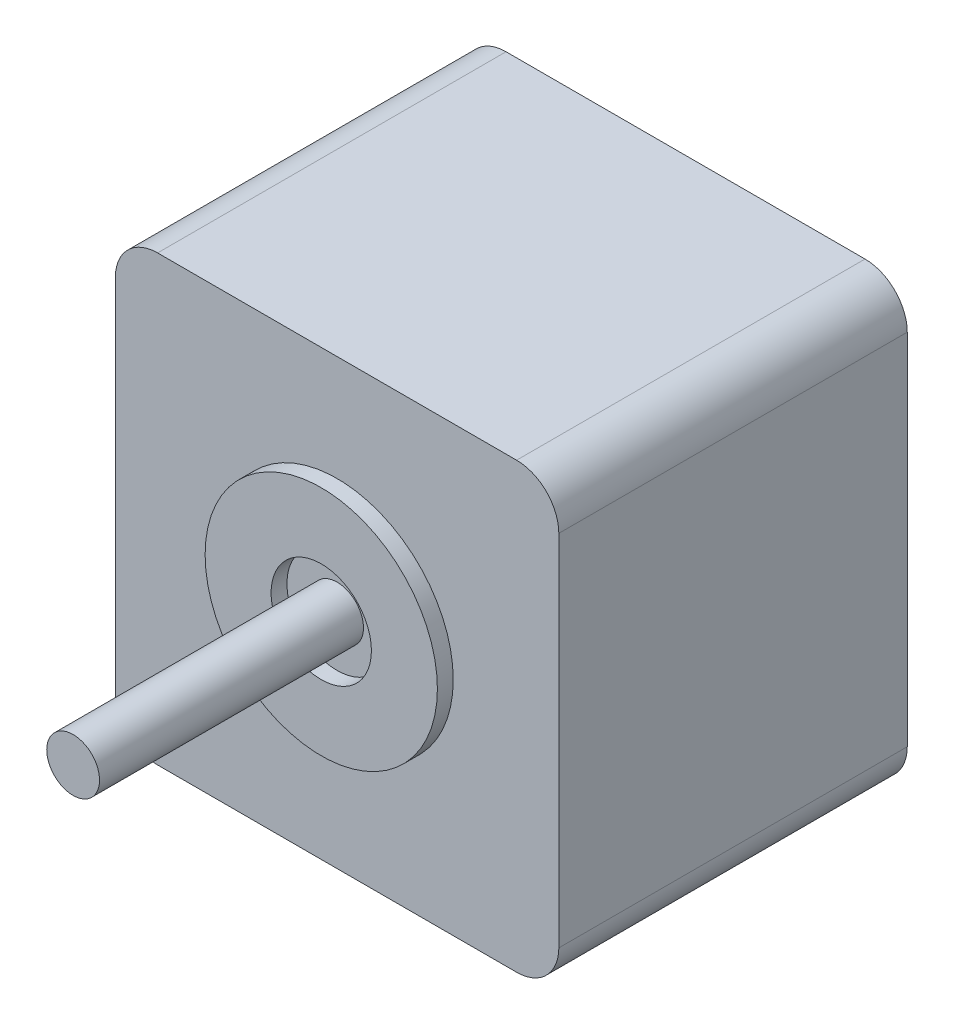
ISO-10303-21;
HEADER;
FILE_DESCRIPTION(('STEP AP214'),'2;1');
FILE_NAME('part.step','',(''),(''),'','','');
FILE_SCHEMA(('AUTOMOTIVE_DESIGN { 1 0 10303 214 1 1 1 1 }'));
ENDSEC;
DATA;
#1=APPLICATION_CONTEXT('core data for automotive mechanical design processes');
#2=APPLICATION_PROTOCOL_DEFINITION('international standard','automotive_design',2000,#1);
#3=PRODUCT_CONTEXT('',#1,'mechanical');
#4=PRODUCT('Part','Part','',(#3));
#5=PRODUCT_RELATED_PRODUCT_CATEGORY('part','',(#4));
#6=PRODUCT_DEFINITION_FORMATION('','',#4);
#7=PRODUCT_DEFINITION_CONTEXT('part definition',#1,'design');
#8=PRODUCT_DEFINITION('design','',#6,#7);
#9=PRODUCT_DEFINITION_SHAPE('','',#8);
#10=(LENGTH_UNIT() NAMED_UNIT(*) SI_UNIT(.MILLI.,.METRE.));
#11=(NAMED_UNIT(*) PLANE_ANGLE_UNIT() SI_UNIT($,.RADIAN.));
#12=(NAMED_UNIT(*) SI_UNIT($,.STERADIAN.) SOLID_ANGLE_UNIT());
#13=UNCERTAINTY_MEASURE_WITH_UNIT(LENGTH_MEASURE(1.E-05),#10,'distance_accuracy_value','');
#14=(GEOMETRIC_REPRESENTATION_CONTEXT(3) GLOBAL_UNCERTAINTY_ASSIGNED_CONTEXT((#13)) GLOBAL_UNIT_ASSIGNED_CONTEXT((#10,
#11,#12)) REPRESENTATION_CONTEXT('',''));
#15=CARTESIAN_POINT('',(0.,0.,0.));
#16=DIRECTION('',(0.,0.,1.));
#17=DIRECTION('',(1.,0.,0.));
#18=AXIS2_PLACEMENT_3D('',#15,#16,#17);
#19=CARTESIAN_POINT('',(21.,-21.,33.));
#20=DIRECTION('',(-1.,0.,0.));
#21=DIRECTION('',(0.,0.,1.));
#22=AXIS2_PLACEMENT_3D('',#19,#20,#21);
#23=PLANE('',#22);
#24=DIRECTION('',(0.,1.,0.));
#25=VECTOR('',#24,1.);
#26=CARTESIAN_POINT('',(21.,-21.,33.));
#27=LINE('',#26,#25);
#28=CARTESIAN_POINT('',(21.,-17.,33.));
#29=VERTEX_POINT('',#28);
#30=CARTESIAN_POINT('',(21.,17.,33.));
#31=VERTEX_POINT('',#30);
#32=EDGE_CURVE('E129',#29,#31,#27,.T.);
#33=ORIENTED_EDGE('',*,*,#32,.F.);
#34=DIRECTION('',(0.,0.,-1.));
#35=VECTOR('',#34,1.);
#36=CARTESIAN_POINT('',(21.,-17.,33.));
#37=LINE('',#36,#35);
#38=CARTESIAN_POINT('',(21.,-17.,0.));
#39=VERTEX_POINT('',#38);
#40=EDGE_CURVE('E155',#29,#39,#37,.T.);
#41=ORIENTED_EDGE('',*,*,#40,.T.);
#42=DIRECTION('',(0.,1.,0.));
#43=VECTOR('',#42,1.);
#44=CARTESIAN_POINT('',(21.,-21.,0.));
#45=LINE('',#44,#43);
#46=CARTESIAN_POINT('',(21.,17.,0.));
#47=VERTEX_POINT('',#46);
#48=EDGE_CURVE('E180',#39,#47,#45,.T.);
#49=ORIENTED_EDGE('',*,*,#48,.T.);
#50=DIRECTION('',(0.,0.,-1.));
#51=VECTOR('',#50,1.);
#52=CARTESIAN_POINT('',(21.,17.,33.));
#53=LINE('',#52,#51);
#54=EDGE_CURVE('E153',#47,#31,#53,.F.);
#55=ORIENTED_EDGE('',*,*,#54,.T.);
#56=EDGE_LOOP('',(#33,#41,#49,#55));
#57=FACE_BOUND('',#56,.T.);
#58=ADVANCED_FACE('F36',(#57),#23,.F.);
#59=CARTESIAN_POINT('',(-21.,21.,33.));
#60=DIRECTION('',(0.,-1.,0.));
#61=DIRECTION('',(0.,0.,-1.));
#62=AXIS2_PLACEMENT_3D('',#59,#60,#61);
#63=PLANE('',#62);
#64=DIRECTION('',(-1.,0.,0.));
#65=VECTOR('',#64,1.);
#66=CARTESIAN_POINT('',(-21.,21.,33.));
#67=LINE('',#66,#65);
#68=CARTESIAN_POINT('',(17.,21.,33.));
#69=VERTEX_POINT('',#68);
#70=CARTESIAN_POINT('',(-17.,21.,33.));
#71=VERTEX_POINT('',#70);
#72=EDGE_CURVE('E132',#69,#71,#67,.T.);
#73=ORIENTED_EDGE('',*,*,#72,.F.);
#74=DIRECTION('',(0.,0.,-1.));
#75=VECTOR('',#74,1.);
#76=CARTESIAN_POINT('',(17.,21.,33.));
#77=LINE('',#76,#75);
#78=CARTESIAN_POINT('',(17.,21.,0.));
#79=VERTEX_POINT('',#78);
#80=EDGE_CURVE('E159',#69,#79,#77,.T.);
#81=ORIENTED_EDGE('',*,*,#80,.T.);
#82=DIRECTION('',(-1.,0.,0.));
#83=VECTOR('',#82,1.);
#84=CARTESIAN_POINT('',(-21.,21.,0.));
#85=LINE('',#84,#83);
#86=CARTESIAN_POINT('',(-17.,21.,0.));
#87=VERTEX_POINT('',#86);
#88=EDGE_CURVE('E134',#79,#87,#85,.T.);
#89=ORIENTED_EDGE('',*,*,#88,.T.);
#90=DIRECTION('',(0.,0.,-1.));
#91=VECTOR('',#90,1.);
#92=CARTESIAN_POINT('',(-17.,21.,33.));
#93=LINE('',#92,#91);
#94=EDGE_CURVE('E51',#87,#71,#93,.F.);
#95=ORIENTED_EDGE('',*,*,#94,.T.);
#96=EDGE_LOOP('',(#73,#81,#89,#95));
#97=FACE_BOUND('',#96,.T.);
#98=ADVANCED_FACE('F184',(#97),#63,.F.);
#99=CARTESIAN_POINT('',(-21.,-21.,33.));
#100=DIRECTION('',(1.,0.,0.));
#101=DIRECTION('',(0.,0.,-1.));
#102=AXIS2_PLACEMENT_3D('',#99,#100,#101);
#103=PLANE('',#102);
#104=DIRECTION('',(0.,-1.,0.));
#105=VECTOR('',#104,1.);
#106=CARTESIAN_POINT('',(-21.,-21.,0.));
#107=LINE('',#106,#105);
#108=CARTESIAN_POINT('',(-21.,17.,0.));
#109=VERTEX_POINT('',#108);
#110=CARTESIAN_POINT('',(-21.,-17.,0.));
#111=VERTEX_POINT('',#110);
#112=EDGE_CURVE('E130',#109,#111,#107,.T.);
#113=ORIENTED_EDGE('',*,*,#112,.T.);
#114=DIRECTION('',(0.,0.,-1.));
#115=VECTOR('',#114,1.);
#116=CARTESIAN_POINT('',(-21.,-17.,33.));
#117=LINE('',#116,#115);
#118=CARTESIAN_POINT('',(-21.,-17.,33.));
#119=VERTEX_POINT('',#118);
#120=EDGE_CURVE('E108',#111,#119,#117,.F.);
#121=ORIENTED_EDGE('',*,*,#120,.T.);
#122=DIRECTION('',(0.,-1.,0.));
#123=VECTOR('',#122,1.);
#124=CARTESIAN_POINT('',(-21.,-21.,33.));
#125=LINE('',#124,#123);
#126=CARTESIAN_POINT('',(-21.,17.,33.));
#127=VERTEX_POINT('',#126);
#128=EDGE_CURVE('E172',#127,#119,#125,.T.);
#129=ORIENTED_EDGE('',*,*,#128,.F.);
#130=DIRECTION('',(0.,0.,-1.));
#131=VECTOR('',#130,1.);
#132=CARTESIAN_POINT('',(-21.,17.,33.));
#133=LINE('',#132,#131);
#134=EDGE_CURVE('E113',#127,#109,#133,.T.);
#135=ORIENTED_EDGE('',*,*,#134,.T.);
#136=EDGE_LOOP('',(#113,#121,#129,#135));
#137=FACE_BOUND('',#136,.T.);
#138=ADVANCED_FACE('F187',(#137),#103,.F.);
#139=CARTESIAN_POINT('',(-21.,-21.,33.));
#140=DIRECTION('',(0.,1.,0.));
#141=DIRECTION('',(0.,0.,1.));
#142=AXIS2_PLACEMENT_3D('',#139,#140,#141);
#143=PLANE('',#142);
#144=DIRECTION('',(1.,0.,0.));
#145=VECTOR('',#144,1.);
#146=CARTESIAN_POINT('',(-21.,-21.,33.));
#147=LINE('',#146,#145);
#148=CARTESIAN_POINT('',(-17.,-21.,33.));
#149=VERTEX_POINT('',#148);
#150=CARTESIAN_POINT('',(17.,-21.,33.));
#151=VERTEX_POINT('',#150);
#152=EDGE_CURVE('E123',#149,#151,#147,.T.);
#153=ORIENTED_EDGE('',*,*,#152,.F.);
#154=DIRECTION('',(0.,0.,-1.));
#155=VECTOR('',#154,1.);
#156=CARTESIAN_POINT('',(-17.,-21.,33.));
#157=LINE('',#156,#155);
#158=CARTESIAN_POINT('',(-17.,-21.,0.));
#159=VERTEX_POINT('',#158);
#160=EDGE_CURVE('E107',#149,#159,#157,.T.);
#161=ORIENTED_EDGE('',*,*,#160,.T.);
#162=DIRECTION('',(1.,0.,0.));
#163=VECTOR('',#162,1.);
#164=CARTESIAN_POINT('',(-21.,-21.,0.));
#165=LINE('',#164,#163);
#166=CARTESIAN_POINT('',(17.,-21.,0.));
#167=VERTEX_POINT('',#166);
#168=EDGE_CURVE('E120',#159,#167,#165,.T.);
#169=ORIENTED_EDGE('',*,*,#168,.T.);
#170=DIRECTION('',(0.,0.,-1.));
#171=VECTOR('',#170,1.);
#172=CARTESIAN_POINT('',(17.,-21.,33.));
#173=LINE('',#172,#171);
#174=EDGE_CURVE('E125',#167,#151,#173,.F.);
#175=ORIENTED_EDGE('',*,*,#174,.T.);
#176=EDGE_LOOP('',(#153,#161,#169,#175));
#177=FACE_BOUND('',#176,.T.);
#178=ADVANCED_FACE('F119',(#177),#143,.F.);
#179=CARTESIAN_POINT('',(0.,0.,33.));
#180=DIRECTION('',(0.,0.,-1.));
#181=DIRECTION('',(-1.,0.,0.));
#182=AXIS2_PLACEMENT_3D('',#179,#180,#181);
#183=PLANE('',#182);
#184=CARTESIAN_POINT('',(0.,0.,33.));
#185=DIRECTION('',(0.,0.,-1.));
#186=DIRECTION('',(-1.,0.,0.));
#187=AXIS2_PLACEMENT_3D('',#184,#185,#186);
#188=CIRCLE('',#187,11.);
#189=CARTESIAN_POINT('',(-11.,0.,33.));
#190=VERTEX_POINT('',#189);
#191=EDGE_CURVE('E44',#190,#190,#188,.F.);
#192=ORIENTED_EDGE('',*,*,#191,.F.);
#193=EDGE_LOOP('',(#192));
#194=FACE_BOUND('',#193,.T.);
#195=ORIENTED_EDGE('',*,*,#128,.T.);
#196=CARTESIAN_POINT('',(-17.,-17.,33.));
#197=DIRECTION('',(0.,0.,-1.));
#198=DIRECTION('',(-1.,0.,0.));
#199=AXIS2_PLACEMENT_3D('',#196,#197,#198);
#200=CIRCLE('',#199,4.);
#201=EDGE_CURVE('E151',#119,#149,#200,.F.);
#202=ORIENTED_EDGE('',*,*,#201,.T.);
#203=ORIENTED_EDGE('',*,*,#152,.T.);
#204=CARTESIAN_POINT('',(17.,-17.,33.));
#205=DIRECTION('',(0.,0.,-1.));
#206=DIRECTION('',(-1.,0.,0.));
#207=AXIS2_PLACEMENT_3D('',#204,#205,#206);
#208=CIRCLE('',#207,4.);
#209=EDGE_CURVE('E149',#151,#29,#208,.F.);
#210=ORIENTED_EDGE('',*,*,#209,.T.);
#211=ORIENTED_EDGE('',*,*,#32,.T.);
#212=CARTESIAN_POINT('',(17.,17.,33.));
#213=DIRECTION('',(0.,0.,-1.));
#214=DIRECTION('',(-1.,0.,0.));
#215=AXIS2_PLACEMENT_3D('',#212,#213,#214);
#216=CIRCLE('',#215,4.);
#217=EDGE_CURVE('E58',#31,#69,#216,.F.);
#218=ORIENTED_EDGE('',*,*,#217,.T.);
#219=ORIENTED_EDGE('',*,*,#72,.T.);
#220=CARTESIAN_POINT('',(-17.,17.,33.));
#221=DIRECTION('',(0.,0.,-1.));
#222=DIRECTION('',(-1.,0.,0.));
#223=AXIS2_PLACEMENT_3D('',#220,#221,#222);
#224=CIRCLE('',#223,4.);
#225=EDGE_CURVE('E146',#71,#127,#224,.F.);
#226=ORIENTED_EDGE('',*,*,#225,.T.);
#227=EDGE_LOOP('',(#195,#202,#203,#210,#211,#218,#219,#226));
#228=FACE_BOUND('',#227,.T.);
#229=ADVANCED_FACE('F166',(#194,#228),#183,.F.);
#230=CARTESIAN_POINT('',(0.,0.,0.));
#231=DIRECTION('',(0.,0.,-1.));
#232=DIRECTION('',(-1.,0.,0.));
#233=AXIS2_PLACEMENT_3D('',#230,#231,#232);
#234=PLANE('',#233);
#235=ORIENTED_EDGE('',*,*,#168,.F.);
#236=CARTESIAN_POINT('',(-17.,-17.,0.));
#237=DIRECTION('',(0.,0.,-1.));
#238=DIRECTION('',(-1.,0.,0.));
#239=AXIS2_PLACEMENT_3D('',#236,#237,#238);
#240=CIRCLE('',#239,4.);
#241=EDGE_CURVE('E103',#159,#111,#240,.T.);
#242=ORIENTED_EDGE('',*,*,#241,.T.);
#243=ORIENTED_EDGE('',*,*,#112,.F.);
#244=CARTESIAN_POINT('',(-17.,17.,0.));
#245=DIRECTION('',(0.,0.,-1.));
#246=DIRECTION('',(-1.,0.,0.));
#247=AXIS2_PLACEMENT_3D('',#244,#245,#246);
#248=CIRCLE('',#247,4.);
#249=EDGE_CURVE('E124',#109,#87,#248,.T.);
#250=ORIENTED_EDGE('',*,*,#249,.T.);
#251=ORIENTED_EDGE('',*,*,#88,.F.);
#252=CARTESIAN_POINT('',(17.,17.,0.));
#253=DIRECTION('',(0.,0.,-1.));
#254=DIRECTION('',(-1.,0.,0.));
#255=AXIS2_PLACEMENT_3D('',#252,#253,#254);
#256=CIRCLE('',#255,4.);
#257=EDGE_CURVE('E140',#79,#47,#256,.T.);
#258=ORIENTED_EDGE('',*,*,#257,.T.);
#259=ORIENTED_EDGE('',*,*,#48,.F.);
#260=CARTESIAN_POINT('',(17.,-17.,0.));
#261=DIRECTION('',(0.,0.,-1.));
#262=DIRECTION('',(-1.,0.,0.));
#263=AXIS2_PLACEMENT_3D('',#260,#261,#262);
#264=CIRCLE('',#263,4.);
#265=EDGE_CURVE('E114',#39,#167,#264,.T.);
#266=ORIENTED_EDGE('',*,*,#265,.T.);
#267=EDGE_LOOP('',(#235,#242,#243,#250,#251,#258,#259,#266));
#268=FACE_BOUND('',#267,.T.);
#269=ADVANCED_FACE('F127',(#268),#234,.T.);
#270=CARTESIAN_POINT('',(-17.,-17.,33.));
#271=DIRECTION('',(0.,0.,-1.));
#272=DIRECTION('',(-1.,0.,0.));
#273=AXIS2_PLACEMENT_3D('',#270,#271,#272);
#274=CYLINDRICAL_SURFACE('',#273,4.);
#275=ORIENTED_EDGE('',*,*,#201,.F.);
#276=ORIENTED_EDGE('',*,*,#120,.F.);
#277=ORIENTED_EDGE('',*,*,#241,.F.);
#278=ORIENTED_EDGE('',*,*,#160,.F.);
#279=EDGE_LOOP('',(#275,#276,#277,#278));
#280=FACE_BOUND('',#279,.T.);
#281=ADVANCED_FACE('F106',(#280),#274,.T.);
#282=CARTESIAN_POINT('',(17.,-17.,33.));
#283=DIRECTION('',(0.,0.,-1.));
#284=DIRECTION('',(-1.,0.,0.));
#285=AXIS2_PLACEMENT_3D('',#282,#283,#284);
#286=CYLINDRICAL_SURFACE('',#285,4.);
#287=ORIENTED_EDGE('',*,*,#209,.F.);
#288=ORIENTED_EDGE('',*,*,#174,.F.);
#289=ORIENTED_EDGE('',*,*,#265,.F.);
#290=ORIENTED_EDGE('',*,*,#40,.F.);
#291=EDGE_LOOP('',(#287,#288,#289,#290));
#292=FACE_BOUND('',#291,.T.);
#293=ADVANCED_FACE('F205',(#292),#286,.T.);
#294=CARTESIAN_POINT('',(17.,17.,33.));
#295=DIRECTION('',(0.,0.,-1.));
#296=DIRECTION('',(-1.,0.,0.));
#297=AXIS2_PLACEMENT_3D('',#294,#295,#296);
#298=CYLINDRICAL_SURFACE('',#297,4.);
#299=ORIENTED_EDGE('',*,*,#217,.F.);
#300=ORIENTED_EDGE('',*,*,#54,.F.);
#301=ORIENTED_EDGE('',*,*,#257,.F.);
#302=ORIENTED_EDGE('',*,*,#80,.F.);
#303=EDGE_LOOP('',(#299,#300,#301,#302));
#304=FACE_BOUND('',#303,.T.);
#305=ADVANCED_FACE('F207',(#304),#298,.T.);
#306=CARTESIAN_POINT('',(-17.,17.,33.));
#307=DIRECTION('',(0.,0.,-1.));
#308=DIRECTION('',(-1.,0.,0.));
#309=AXIS2_PLACEMENT_3D('',#306,#307,#308);
#310=CYLINDRICAL_SURFACE('',#309,4.);
#311=ORIENTED_EDGE('',*,*,#225,.F.);
#312=ORIENTED_EDGE('',*,*,#94,.F.);
#313=ORIENTED_EDGE('',*,*,#249,.F.);
#314=ORIENTED_EDGE('',*,*,#134,.F.);
#315=EDGE_LOOP('',(#311,#312,#313,#314));
#316=FACE_BOUND('',#315,.T.);
#317=ADVANCED_FACE('F38',(#316),#310,.T.);
#318=CARTESIAN_POINT('',(0.,0.,34.5));
#319=DIRECTION('',(0.,0.,-1.));
#320=DIRECTION('',(-1.,0.,0.));
#321=AXIS2_PLACEMENT_3D('',#318,#319,#320);
#322=CYLINDRICAL_SURFACE('',#321,4.75);
#323=CARTESIAN_POINT('',(0.,0.,34.5));
#324=DIRECTION('',(0.,0.,1.));
#325=DIRECTION('',(1.,0.,0.));
#326=AXIS2_PLACEMENT_3D('',#323,#324,#325);
#327=CIRCLE('',#326,4.75);
#328=CARTESIAN_POINT('',(4.75,0.,34.5));
#329=VERTEX_POINT('',#328);
#330=EDGE_CURVE('E316',#329,#329,#327,.T.);
#331=ORIENTED_EDGE('',*,*,#330,.T.);
#332=EDGE_LOOP('',(#331));
#333=FACE_BOUND('',#332,.T.);
#334=CARTESIAN_POINT('',(0.,0.,33.));
#335=DIRECTION('',(0.,0.,1.));
#336=DIRECTION('',(1.,0.,0.));
#337=AXIS2_PLACEMENT_3D('',#334,#335,#336);
#338=CIRCLE('',#337,4.75);
#339=CARTESIAN_POINT('',(4.75,0.,33.));
#340=VERTEX_POINT('',#339);
#341=EDGE_CURVE('E313',#340,#340,#338,.T.);
#342=ORIENTED_EDGE('',*,*,#341,.F.);
#343=EDGE_LOOP('',(#342));
#344=FACE_BOUND('',#343,.T.);
#345=ADVANCED_FACE('F214',(#333,#344),#322,.F.);
#346=CARTESIAN_POINT('',(0.,0.,34.5));
#347=DIRECTION('',(0.,0.,-1.));
#348=DIRECTION('',(-1.,0.,0.));
#349=AXIS2_PLACEMENT_3D('',#346,#347,#348);
#350=CYLINDRICAL_SURFACE('',#349,11.);
#351=CARTESIAN_POINT('',(0.,0.,34.5));
#352=DIRECTION('',(0.,0.,1.));
#353=DIRECTION('',(1.,0.,0.));
#354=AXIS2_PLACEMENT_3D('',#351,#352,#353);
#355=CIRCLE('',#354,11.);
#356=CARTESIAN_POINT('',(11.,0.,34.5));
#357=VERTEX_POINT('',#356);
#358=EDGE_CURVE('E182',#357,#357,#355,.T.);
#359=ORIENTED_EDGE('',*,*,#358,.F.);
#360=EDGE_LOOP('',(#359));
#361=FACE_BOUND('',#360,.T.);
#362=ORIENTED_EDGE('',*,*,#191,.T.);
#363=EDGE_LOOP('',(#362));
#364=FACE_BOUND('',#363,.T.);
#365=ADVANCED_FACE('F164',(#361,#364),#350,.T.);
#366=CARTESIAN_POINT('',(0.,0.,34.5));
#367=DIRECTION('',(0.,0.,1.));
#368=DIRECTION('',(1.,0.,0.));
#369=AXIS2_PLACEMENT_3D('',#366,#367,#368);
#370=PLANE('',#369);
#371=ORIENTED_EDGE('',*,*,#330,.F.);
#372=EDGE_LOOP('',(#371));
#373=FACE_BOUND('',#372,.T.);
#374=ORIENTED_EDGE('',*,*,#358,.T.);
#375=EDGE_LOOP('',(#374));
#376=FACE_BOUND('',#375,.T.);
#377=ADVANCED_FACE('F226',(#373,#376),#370,.T.);
#378=CARTESIAN_POINT('',(0.,0.,33.));
#379=DIRECTION('',(0.,0.,-1.));
#380=DIRECTION('',(-1.,0.,0.));
#381=AXIS2_PLACEMENT_3D('',#378,#379,#380);
#382=CIRCLE('',#381,2.5);
#383=CARTESIAN_POINT('',(-2.5,0.,33.));
#384=VERTEX_POINT('',#383);
#385=EDGE_CURVE('E11',#384,#384,#382,.F.);
#386=ORIENTED_EDGE('',*,*,#385,.F.);
#387=EDGE_LOOP('',(#386));
#388=FACE_BOUND('',#387,.T.);
#389=ORIENTED_EDGE('',*,*,#341,.T.);
#390=EDGE_LOOP('',(#389));
#391=FACE_BOUND('',#390,.T.);
#392=ADVANCED_FACE('F169',(#388,#391),#183,.F.);
#393=CARTESIAN_POINT('',(0.,0.,58.));
#394=DIRECTION('',(0.,0.,-1.));
#395=DIRECTION('',(-1.,0.,0.));
#396=AXIS2_PLACEMENT_3D('',#393,#394,#395);
#397=CYLINDRICAL_SURFACE('',#396,2.5);
#398=CARTESIAN_POINT('',(0.,0.,58.));
#399=DIRECTION('',(0.,0.,1.));
#400=DIRECTION('',(1.,0.,0.));
#401=AXIS2_PLACEMENT_3D('',#398,#399,#400);
#402=CIRCLE('',#401,2.5);
#403=CARTESIAN_POINT('',(2.5,0.,58.));
#404=VERTEX_POINT('',#403);
#405=EDGE_CURVE('E312',#404,#404,#402,.T.);
#406=ORIENTED_EDGE('',*,*,#405,.F.);
#407=EDGE_LOOP('',(#406));
#408=FACE_BOUND('',#407,.T.);
#409=ORIENTED_EDGE('',*,*,#385,.T.);
#410=EDGE_LOOP('',(#409));
#411=FACE_BOUND('',#410,.T.);
#412=ADVANCED_FACE('F288',(#408,#411),#397,.T.);
#413=CARTESIAN_POINT('',(0.,0.,58.));
#414=DIRECTION('',(0.,0.,1.));
#415=DIRECTION('',(1.,0.,0.));
#416=AXIS2_PLACEMENT_3D('',#413,#414,#415);
#417=PLANE('',#416);
#418=ORIENTED_EDGE('',*,*,#405,.T.);
#419=EDGE_LOOP('',(#418));
#420=FACE_BOUND('',#419,.T.);
#421=ADVANCED_FACE('F296',(#420),#417,.T.);
#422=CLOSED_SHELL('',(#58,#98,#138,#178,#229,#269,#281,#293,#305,#317,#345,#365,#377,#392,#412,#421));
#423=MANIFOLD_SOLID_BREP('B2',#422);
#424=ADVANCED_BREP_SHAPE_REPRESENTATION('',(#18,#423),#14);
#425=SHAPE_DEFINITION_REPRESENTATION(#9,#424);
ENDSEC;
END-ISO-10303-21;
